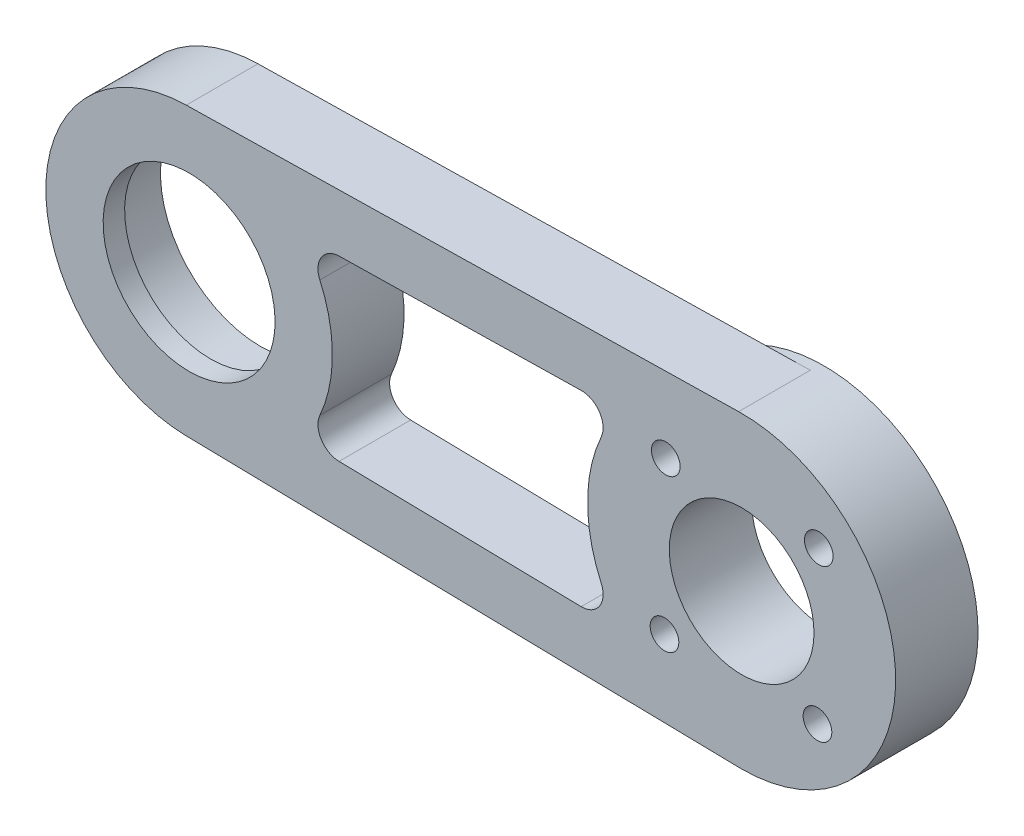
ISO-10303-21;
HEADER;
FILE_DESCRIPTION(('STEP AP214'),'2;1');
FILE_NAME('part.step','',(''),(''),'','','');
FILE_SCHEMA(('AUTOMOTIVE_DESIGN { 1 0 10303 214 1 1 1 1 }'));
ENDSEC;
DATA;
#1=APPLICATION_CONTEXT('core data for automotive mechanical design processes');
#2=APPLICATION_PROTOCOL_DEFINITION('international standard','automotive_design',2000,#1);
#3=PRODUCT_CONTEXT('',#1,'mechanical');
#4=PRODUCT('Part','Part','',(#3));
#5=PRODUCT_RELATED_PRODUCT_CATEGORY('part','',(#4));
#6=PRODUCT_DEFINITION_FORMATION('','',#4);
#7=PRODUCT_DEFINITION_CONTEXT('part definition',#1,'design');
#8=PRODUCT_DEFINITION('design','',#6,#7);
#9=PRODUCT_DEFINITION_SHAPE('','',#8);
#10=(LENGTH_UNIT() NAMED_UNIT(*) SI_UNIT(.MILLI.,.METRE.));
#11=(NAMED_UNIT(*) PLANE_ANGLE_UNIT() SI_UNIT($,.RADIAN.));
#12=(NAMED_UNIT(*) SI_UNIT($,.STERADIAN.) SOLID_ANGLE_UNIT());
#13=UNCERTAINTY_MEASURE_WITH_UNIT(LENGTH_MEASURE(1.E-05),#10,'distance_accuracy_value','');
#14=(GEOMETRIC_REPRESENTATION_CONTEXT(3) GLOBAL_UNCERTAINTY_ASSIGNED_CONTEXT((#13)) GLOBAL_UNIT_ASSIGNED_CONTEXT((#10,
#11,#12)) REPRESENTATION_CONTEXT('',''));
#15=CARTESIAN_POINT('',(0.,0.,0.));
#16=DIRECTION('',(0.,0.,1.));
#17=DIRECTION('',(1.,0.,0.));
#18=AXIS2_PLACEMENT_3D('',#15,#16,#17);
#19=CARTESIAN_POINT('',(39.3125,0.,89.2));
#20=DIRECTION('',(0.,0.,1.));
#21=DIRECTION('',(0.,1.,0.));
#22=AXIS2_PLACEMENT_3D('',#19,#20,#21);
#23=PLANE('',#22);
#24=CARTESIAN_POINT('',(87.8932333873582,10.5856105027242,89.2));
#25=DIRECTION('',(0.,0.,1.));
#26=DIRECTION('',(-1.,0.,0.));
#27=AXIS2_PLACEMENT_3D('',#24,#25,#26);
#28=CIRCLE('',#27,1.99999999999999);
#29=CARTESIAN_POINT('',(85.8932333873582,10.5856105027242,89.2));
#30=VERTEX_POINT('',#29);
#31=EDGE_CURVE('E618',#30,#30,#28,.T.);
#32=ORIENTED_EDGE('',*,*,#31,.F.);
#33=EDGE_LOOP('',(#32));
#34=FACE_BOUND('',#33,.T.);
#35=CARTESIAN_POINT('',(66.3567666126418,-10.5856105027242,89.2));
#36=DIRECTION('',(0.,0.,1.));
#37=DIRECTION('',(1.,0.,0.));
#38=AXIS2_PLACEMENT_3D('',#35,#36,#37);
#39=CIRCLE('',#38,2.);
#40=CARTESIAN_POINT('',(68.3567666126418,-10.5856105027242,89.2));
#41=VERTEX_POINT('',#40);
#42=EDGE_CURVE('E622',#41,#41,#39,.T.);
#43=ORIENTED_EDGE('',*,*,#42,.F.);
#44=EDGE_LOOP('',(#43));
#45=FACE_BOUND('',#44,.T.);
#46=CARTESIAN_POINT('',(87.7106105027242,-10.7682333873582,89.2));
#47=DIRECTION('',(0.,0.,1.));
#48=DIRECTION('',(-1.,0.,0.));
#49=AXIS2_PLACEMENT_3D('',#46,#47,#48);
#50=CIRCLE('',#49,1.99999999999999);
#51=CARTESIAN_POINT('',(85.7106105027242,-10.7682333873582,89.2));
#52=VERTEX_POINT('',#51);
#53=EDGE_CURVE('E631',#52,#52,#50,.T.);
#54=ORIENTED_EDGE('',*,*,#53,.F.);
#55=EDGE_LOOP('',(#54));
#56=FACE_BOUND('',#55,.T.);
#57=CARTESIAN_POINT('',(66.5393894972758,10.7682333873582,89.2));
#58=DIRECTION('',(0.,0.,1.));
#59=DIRECTION('',(1.,0.,0.));
#60=AXIS2_PLACEMENT_3D('',#57,#58,#59);
#61=CIRCLE('',#60,2.);
#62=CARTESIAN_POINT('',(68.5393894972758,10.7682333873582,89.2));
#63=VERTEX_POINT('',#62);
#64=EDGE_CURVE('E219',#63,#63,#61,.T.);
#65=ORIENTED_EDGE('',*,*,#64,.F.);
#66=EDGE_LOOP('',(#65));
#67=FACE_BOUND('',#66,.T.);
#68=CARTESIAN_POINT('',(54.7890294242375,10.0674931556305,89.2));
#69=DIRECTION('',(0.,0.,1.));
#70=DIRECTION('',(0.834598495743948,0.55085873951671,0.));
#71=AXIS2_PLACEMENT_3D('',#68,#69,#70);
#72=CIRCLE('',#71,3.);
#73=CARTESIAN_POINT('',(57.5240462294328,8.8347388916758,89.2));
#74=VERTEX_POINT('',#73);
#75=CARTESIAN_POINT('',(54.7306825846913,13.0669257096839,89.2));
#76=VERTEX_POINT('',#75);
#77=EDGE_CURVE('E240',#74,#76,#72,.T.);
#78=ORIENTED_EDGE('',*,*,#77,.F.);
#79=CARTESIAN_POINT('',(77.125,0.,89.2));
#80=DIRECTION('',(0.,0.,-1.));
#81=DIRECTION('',(0.,-1.,0.));
#82=AXIS2_PLACEMENT_3D('',#79,#80,#81);
#83=CIRCLE('',#82,21.5);
#84=CARTESIAN_POINT('',(57.5240462294328,-8.8347388916758,89.2));
#85=VERTEX_POINT('',#84);
#86=EDGE_CURVE('E299',#85,#74,#83,.T.);
#87=ORIENTED_EDGE('',*,*,#86,.F.);
#88=CARTESIAN_POINT('',(54.7890294242375,-10.0674931556305,89.2));
#89=DIRECTION('',(0.,0.,1.));
#90=DIRECTION('',(0.834598495743948,-0.55085873951671,0.));
#91=AXIS2_PLACEMENT_3D('',#88,#89,#90);
#92=CIRCLE('',#91,3.);
#93=CARTESIAN_POINT('',(54.7306825846913,-13.0669257096839,89.2));
#94=VERTEX_POINT('',#93);
#95=EDGE_CURVE('E250',#94,#85,#92,.T.);
#96=ORIENTED_EDGE('',*,*,#95,.F.);
#97=DIRECTION('',(0.999810851351115,-0.0194489465153972,0.));
#98=VECTOR('',#97,1.);
#99=CARTESIAN_POINT('',(49.5983229947105,-12.9670878383221,89.2));
#100=LINE('',#99,#98);
#101=CARTESIAN_POINT('',(20.9286196080458,-12.4093868221489,89.2));
#102=VERTEX_POINT('',#101);
#103=EDGE_CURVE('E195',#102,#94,#100,.T.);
#104=ORIENTED_EDGE('',*,*,#103,.F.);
#105=CARTESIAN_POINT('',(20.9869664475919,-9.40995426809553,89.2));
#106=DIRECTION('',(0.,0.,1.));
#107=DIRECTION('',(-0.844629437346953,-0.535351392607669,0.));
#108=AXIS2_PLACEMENT_3D('',#105,#106,#107);
#109=CIRCLE('',#108,3.);
#110=CARTESIAN_POINT('',(18.2495360413844,-8.18256892877871,89.2));
#111=VERTEX_POINT('',#110);
#112=EDGE_CURVE('E203',#111,#102,#109,.T.);
#113=ORIENTED_EDGE('',*,*,#112,.F.);
#114=CARTESIAN_POINT('',(0.,0.,89.2));
#115=DIRECTION('',(0.,0.,-1.));
#116=DIRECTION('',(-0.0194489465153973,-0.999810851351115,0.));
#117=AXIS2_PLACEMENT_3D('',#114,#115,#116);
#118=CIRCLE('',#117,20.);
#119=CARTESIAN_POINT('',(18.2495360413844,8.18256892877871,89.2));
#120=VERTEX_POINT('',#119);
#121=EDGE_CURVE('E236',#120,#111,#118,.T.);
#122=ORIENTED_EDGE('',*,*,#121,.F.);
#123=CARTESIAN_POINT('',(20.9869664475919,9.4099542680955,89.2));
#124=DIRECTION('',(0.,0.,1.));
#125=DIRECTION('',(-0.844629437346952,0.53535139260767,0.));
#126=AXIS2_PLACEMENT_3D('',#123,#124,#125);
#127=CIRCLE('',#126,3.);
#128=CARTESIAN_POINT('',(20.9286196080458,12.4093868221489,89.2));
#129=VERTEX_POINT('',#128);
#130=EDGE_CURVE('E227',#129,#120,#127,.T.);
#131=ORIENTED_EDGE('',*,*,#130,.F.);
#132=DIRECTION('',(-0.999810851351115,-0.0194489465153972,0.));
#133=VECTOR('',#132,1.);
#134=CARTESIAN_POINT('',(27.4139142496106,12.5355428330083,89.2));
#135=LINE('',#134,#133);
#136=EDGE_CURVE('E223',#76,#129,#135,.T.);
#137=ORIENTED_EDGE('',*,*,#136,.F.);
#138=EDGE_LOOP('',(#78,#87,#96,#104,#113,#122,#131,#137));
#139=FACE_BOUND('',#138,.T.);
#140=CARTESIAN_POINT('',(77.125,0.,89.2));
#141=DIRECTION('',(0.,0.,-1.));
#142=DIRECTION('',(0.,-1.,0.));
#143=AXIS2_PLACEMENT_3D('',#140,#141,#142);
#144=CIRCLE('',#143,21.5);
#145=CARTESIAN_POINT('',(76.706847649919,21.4959333040489,89.2));
#146=VERTEX_POINT('',#145);
#147=CARTESIAN_POINT('',(76.706847649919,-21.495933304049,89.2));
#148=VERTEX_POINT('',#147);
#149=EDGE_CURVE('E283',#146,#148,#144,.T.);
#150=ORIENTED_EDGE('',*,*,#149,.F.);
#151=DIRECTION('',(0.999810851351115,0.0194489465153971,0.));
#152=VECTOR('',#151,1.);
#153=CARTESIAN_POINT('',(57.807749156792,21.1282962102074,89.2));
#154=LINE('',#153,#152);
#155=CARTESIAN_POINT('',(-0.388978930307898,19.9962170270223,89.2));
#156=VERTEX_POINT('',#155);
#157=EDGE_CURVE('E346',#156,#146,#154,.T.);
#158=ORIENTED_EDGE('',*,*,#157,.F.);
#159=CARTESIAN_POINT('',(0.,0.,89.2));
#160=DIRECTION('',(0.,0.,-1.));
#161=DIRECTION('',(-0.0194489465153973,0.999810851351115,0.));
#162=AXIS2_PLACEMENT_3D('',#159,#160,#161);
#163=CIRCLE('',#162,20.);
#164=CARTESIAN_POINT('',(-0.388978930307898,-19.9962170270223,89.2));
#165=VERTEX_POINT('',#164);
#166=EDGE_CURVE('E70',#165,#156,#163,.T.);
#167=ORIENTED_EDGE('',*,*,#166,.F.);
#168=DIRECTION('',(-0.999810851351115,0.0194489465153972,0.));
#169=VECTOR('',#168,1.);
#170=CARTESIAN_POINT('',(19.2598358666786,-20.378438071694,89.2));
#171=LINE('',#170,#169);
#172=EDGE_CURVE('E350',#148,#165,#171,.T.);
#173=ORIENTED_EDGE('',*,*,#172,.F.);
#174=EDGE_LOOP('',(#150,#158,#167,#173));
#175=FACE_BOUND('',#174,.T.);
#176=CARTESIAN_POINT('',(0.,0.,89.2));
#177=DIRECTION('',(0.,0.,1.));
#178=DIRECTION('',(0.,1.,0.));
#179=AXIS2_PLACEMENT_3D('',#176,#177,#178);
#180=CIRCLE('',#179,12.);
#181=CARTESIAN_POINT('',(0.,-12.,89.2));
#182=VERTEX_POINT('',#181);
#183=EDGE_CURVE('E323',#182,#182,#180,.T.);
#184=ORIENTED_EDGE('',*,*,#183,.F.);
#185=EDGE_LOOP('',(#184));
#186=FACE_BOUND('',#185,.T.);
#187=CARTESIAN_POINT('',(77.125,0.,89.2));
#188=DIRECTION('',(0.,0.,1.));
#189=DIRECTION('',(0.,1.,0.));
#190=AXIS2_PLACEMENT_3D('',#187,#188,#189);
#191=CIRCLE('',#190,10.1);
#192=CARTESIAN_POINT('',(77.125,10.1,89.2));
#193=VERTEX_POINT('',#192);
#194=EDGE_CURVE('E11',#193,#193,#191,.T.);
#195=ORIENTED_EDGE('',*,*,#194,.F.);
#196=EDGE_LOOP('',(#195));
#197=FACE_BOUND('',#196,.T.);
#198=ADVANCED_FACE('F51',(#34,#45,#56,#67,#139,#175,#186,#197),#23,.T.);
#199=CARTESIAN_POINT('',(77.125,0.,77.7));
#200=DIRECTION('',(0.,0.,1.));
#201=DIRECTION('',(0.,1.,0.));
#202=AXIS2_PLACEMENT_3D('',#199,#200,#201);
#203=PLANE('',#202);
#204=CARTESIAN_POINT('',(87.8932333873582,10.5856105027242,77.7));
#205=DIRECTION('',(0.,0.,1.));
#206=DIRECTION('',(-1.,0.,0.));
#207=AXIS2_PLACEMENT_3D('',#204,#205,#206);
#208=CIRCLE('',#207,1.99999999999999);
#209=CARTESIAN_POINT('',(85.8932333873582,10.5856105027242,77.7));
#210=VERTEX_POINT('',#209);
#211=EDGE_CURVE('E615',#210,#210,#208,.T.);
#212=ORIENTED_EDGE('',*,*,#211,.T.);
#213=EDGE_LOOP('',(#212));
#214=FACE_BOUND('',#213,.T.);
#215=CARTESIAN_POINT('',(66.3567666126418,-10.5856105027242,77.7));
#216=DIRECTION('',(0.,0.,1.));
#217=DIRECTION('',(1.,0.,0.));
#218=AXIS2_PLACEMENT_3D('',#215,#216,#217);
#219=CIRCLE('',#218,2.);
#220=CARTESIAN_POINT('',(68.3567666126418,-10.5856105027242,77.7));
#221=VERTEX_POINT('',#220);
#222=EDGE_CURVE('E619',#221,#221,#219,.T.);
#223=ORIENTED_EDGE('',*,*,#222,.T.);
#224=EDGE_LOOP('',(#223));
#225=FACE_BOUND('',#224,.T.);
#226=CARTESIAN_POINT('',(87.7106105027242,-10.7682333873582,77.7));
#227=DIRECTION('',(0.,0.,1.));
#228=DIRECTION('',(-1.,0.,0.));
#229=AXIS2_PLACEMENT_3D('',#226,#227,#228);
#230=CIRCLE('',#229,1.99999999999999);
#231=CARTESIAN_POINT('',(85.7106105027242,-10.7682333873582,77.7));
#232=VERTEX_POINT('',#231);
#233=EDGE_CURVE('E628',#232,#232,#230,.T.);
#234=ORIENTED_EDGE('',*,*,#233,.T.);
#235=EDGE_LOOP('',(#234));
#236=FACE_BOUND('',#235,.T.);
#237=CARTESIAN_POINT('',(66.5393894972758,10.7682333873582,77.7));
#238=DIRECTION('',(0.,0.,1.));
#239=DIRECTION('',(1.,0.,0.));
#240=AXIS2_PLACEMENT_3D('',#237,#238,#239);
#241=CIRCLE('',#240,2.);
#242=CARTESIAN_POINT('',(68.5393894972758,10.7682333873582,77.7));
#243=VERTEX_POINT('',#242);
#244=EDGE_CURVE('E213',#243,#243,#241,.T.);
#245=ORIENTED_EDGE('',*,*,#244,.T.);
#246=EDGE_LOOP('',(#245));
#247=FACE_BOUND('',#246,.T.);
#248=CARTESIAN_POINT('',(77.125,0.,77.7));
#249=DIRECTION('',(0.,0.,1.));
#250=DIRECTION('',(0.,1.,0.));
#251=AXIS2_PLACEMENT_3D('',#248,#249,#250);
#252=CIRCLE('',#251,10.1);
#253=CARTESIAN_POINT('',(77.125,10.1,77.7));
#254=VERTEX_POINT('',#253);
#255=EDGE_CURVE('E59',#254,#254,#252,.T.);
#256=ORIENTED_EDGE('',*,*,#255,.T.);
#257=EDGE_LOOP('',(#256));
#258=FACE_BOUND('',#257,.T.);
#259=CARTESIAN_POINT('',(77.125,0.,77.7));
#260=DIRECTION('',(0.,0.,-1.));
#261=DIRECTION('',(0.,-1.,0.));
#262=AXIS2_PLACEMENT_3D('',#259,#260,#261);
#263=CIRCLE('',#262,21.5);
#264=CARTESIAN_POINT('',(77.125,-21.5,77.7));
#265=VERTEX_POINT('',#264);
#266=EDGE_CURVE('E274',#265,#265,#263,.T.);
#267=ORIENTED_EDGE('',*,*,#266,.T.);
#268=EDGE_LOOP('',(#267));
#269=FACE_BOUND('',#268,.T.);
#270=ADVANCED_FACE('F497',(#214,#225,#236,#247,#258,#269),#203,.F.);
#271=CARTESIAN_POINT('',(77.125,0.,79.2));
#272=DIRECTION('',(0.,0.,-1.));
#273=DIRECTION('',(0.,1.,0.));
#274=AXIS2_PLACEMENT_3D('',#271,#272,#273);
#275=CYLINDRICAL_SURFACE('',#274,10.1);
#276=ORIENTED_EDGE('',*,*,#194,.T.);
#277=EDGE_LOOP('',(#276));
#278=FACE_BOUND('',#277,.T.);
#279=ORIENTED_EDGE('',*,*,#255,.F.);
#280=EDGE_LOOP('',(#279));
#281=FACE_BOUND('',#280,.T.);
#282=ADVANCED_FACE('F489',(#278,#281),#275,.F.);
#283=CARTESIAN_POINT('',(0.,0.,79.2));
#284=DIRECTION('',(0.,0.,1.));
#285=DIRECTION('',(-0.0194489465153973,0.999810851351115,0.));
#286=AXIS2_PLACEMENT_3D('',#283,#284,#285);
#287=CYLINDRICAL_SURFACE('',#286,20.);
#288=CARTESIAN_POINT('',(0.,0.,79.2));
#289=DIRECTION('',(0.,0.,1.));
#290=DIRECTION('',(-0.0194489465153973,0.999810851351115,0.));
#291=AXIS2_PLACEMENT_3D('',#288,#289,#290);
#292=CIRCLE('',#291,20.);
#293=CARTESIAN_POINT('',(-0.388978930307898,19.9962170270223,79.2));
#294=VERTEX_POINT('',#293);
#295=CARTESIAN_POINT('',(-0.388978930307898,-19.9962170270223,79.2));
#296=VERTEX_POINT('',#295);
#297=EDGE_CURVE('E307',#294,#296,#292,.T.);
#298=ORIENTED_EDGE('',*,*,#297,.T.);
#299=DIRECTION('',(0.,0.,1.));
#300=VECTOR('',#299,1.);
#301=CARTESIAN_POINT('',(-0.388978930307898,-19.9962170270223,79.2));
#302=LINE('',#301,#300);
#303=EDGE_CURVE('E354',#296,#165,#302,.T.);
#304=ORIENTED_EDGE('',*,*,#303,.T.);
#305=ORIENTED_EDGE('',*,*,#166,.T.);
#306=DIRECTION('',(0.,0.,1.));
#307=VECTOR('',#306,1.);
#308=CARTESIAN_POINT('',(-0.388978930307898,19.9962170270223,79.2));
#309=LINE('',#308,#307);
#310=EDGE_CURVE('E278',#294,#156,#309,.T.);
#311=ORIENTED_EDGE('',*,*,#310,.F.);
#312=EDGE_LOOP('',(#298,#304,#305,#311));
#313=FACE_BOUND('',#312,.T.);
#314=ADVANCED_FACE('F480',(#313),#287,.T.);
#315=CARTESIAN_POINT('',(-0.388978930307898,-19.9962170270223,79.2));
#316=DIRECTION('',(-0.0194489465153972,-0.999810851351115,0.));
#317=DIRECTION('',(0.999810851351115,-0.0194489465153972,0.));
#318=AXIS2_PLACEMENT_3D('',#315,#316,#317);
#319=PLANE('',#318);
#320=DIRECTION('',(0.999810851351115,-0.0194489465153972,0.));
#321=VECTOR('',#320,1.);
#322=CARTESIAN_POINT('',(-0.388978930307898,-19.9962170270223,79.2));
#323=LINE('',#322,#321);
#324=CARTESIAN_POINT('',(76.706847649919,-21.495933304049,79.2));
#325=VERTEX_POINT('',#324);
#326=EDGE_CURVE('E304',#296,#325,#323,.T.);
#327=ORIENTED_EDGE('',*,*,#326,.T.);
#328=DIRECTION('',(0.,0.,1.));
#329=VECTOR('',#328,1.);
#330=CARTESIAN_POINT('',(76.706847649919,-21.495933304049,79.2));
#331=LINE('',#330,#329);
#332=EDGE_CURVE('E287',#325,#148,#331,.T.);
#333=ORIENTED_EDGE('',*,*,#332,.T.);
#334=ORIENTED_EDGE('',*,*,#172,.T.);
#335=ORIENTED_EDGE('',*,*,#303,.F.);
#336=EDGE_LOOP('',(#327,#333,#334,#335));
#337=FACE_BOUND('',#336,.T.);
#338=ADVANCED_FACE('F432',(#337),#319,.T.);
#339=CARTESIAN_POINT('',(76.706847649919,21.4959333040489,79.2));
#340=DIRECTION('',(-0.0194489465153971,0.999810851351115,0.));
#341=DIRECTION('',(0.,0.,-1.));
#342=AXIS2_PLACEMENT_3D('',#339,#340,#341);
#343=PLANE('',#342);
#344=DIRECTION('',(-0.999810851351115,-0.0194489465153971,0.));
#345=VECTOR('',#344,1.);
#346=CARTESIAN_POINT('',(76.706847649919,21.4959333040489,79.2));
#347=LINE('',#346,#345);
#348=CARTESIAN_POINT('',(76.706847649919,21.4959333040489,79.2));
#349=VERTEX_POINT('',#348);
#350=EDGE_CURVE('E315',#349,#294,#347,.T.);
#351=ORIENTED_EDGE('',*,*,#350,.T.);
#352=ORIENTED_EDGE('',*,*,#310,.T.);
#353=ORIENTED_EDGE('',*,*,#157,.T.);
#354=DIRECTION('',(0.,0.,1.));
#355=VECTOR('',#354,1.);
#356=CARTESIAN_POINT('',(76.706847649919,21.4959333040489,79.2));
#357=LINE('',#356,#355);
#358=EDGE_CURVE('E292',#349,#146,#357,.T.);
#359=ORIENTED_EDGE('',*,*,#358,.F.);
#360=EDGE_LOOP('',(#351,#352,#353,#359));
#361=FACE_BOUND('',#360,.T.);
#362=ADVANCED_FACE('F366',(#361),#343,.T.);
#363=CARTESIAN_POINT('',(0.,0.,79.2));
#364=DIRECTION('',(0.,0.,1.));
#365=DIRECTION('',(0.,1.,0.));
#366=AXIS2_PLACEMENT_3D('',#363,#364,#365);
#367=CYLINDRICAL_SURFACE('',#366,14.);
#368=CARTESIAN_POINT('',(0.,0.,86.2));
#369=DIRECTION('',(0.,0.,-1.));
#370=DIRECTION('',(0.,1.,0.));
#371=AXIS2_PLACEMENT_3D('',#368,#369,#370);
#372=CIRCLE('',#371,14.);
#373=CARTESIAN_POINT('',(0.,-14.,86.2));
#374=VERTEX_POINT('',#373);
#375=EDGE_CURVE('E308',#374,#374,#372,.T.);
#376=ORIENTED_EDGE('',*,*,#375,.F.);
#377=DIRECTION('',(0.,0.,-1.));
#378=VECTOR('',#377,1.);
#379=CARTESIAN_POINT('',(0.,-14.,79.2));
#380=LINE('',#379,#378);
#381=CARTESIAN_POINT('',(0.,-14.,79.2));
#382=VERTEX_POINT('',#381);
#383=EDGE_CURVE('E275',#374,#382,#380,.T.);
#384=ORIENTED_EDGE('',*,*,#383,.T.);
#385=CARTESIAN_POINT('',(0.,0.,79.2));
#386=DIRECTION('',(0.,0.,-1.));
#387=DIRECTION('',(0.,1.,0.));
#388=AXIS2_PLACEMENT_3D('',#385,#386,#387);
#389=CIRCLE('',#388,14.);
#390=EDGE_CURVE('E279',#382,#382,#389,.T.);
#391=ORIENTED_EDGE('',*,*,#390,.T.);
#392=ORIENTED_EDGE('',*,*,#383,.F.);
#393=EDGE_LOOP('',(#376,#384,#391,#392));
#394=FACE_BOUND('',#393,.T.);
#395=ADVANCED_FACE('F361',(#394),#367,.F.);
#396=CARTESIAN_POINT('',(39.3125,0.,79.2));
#397=DIRECTION('',(0.,0.,1.));
#398=DIRECTION('',(0.,1.,0.));
#399=AXIS2_PLACEMENT_3D('',#396,#397,#398);
#400=PLANE('',#399);
#401=ORIENTED_EDGE('',*,*,#390,.F.);
#402=EDGE_LOOP('',(#401));
#403=FACE_BOUND('',#402,.T.);
#404=CARTESIAN_POINT('',(77.125,0.,79.2));
#405=DIRECTION('',(0.,0.,1.));
#406=DIRECTION('',(0.,-1.,0.));
#407=AXIS2_PLACEMENT_3D('',#404,#405,#406);
#408=CIRCLE('',#407,21.5);
#409=CARTESIAN_POINT('',(57.5240462294328,-8.8347388916758,79.2));
#410=VERTEX_POINT('',#409);
#411=EDGE_CURVE('E291',#410,#325,#408,.T.);
#412=ORIENTED_EDGE('',*,*,#411,.T.);
#413=ORIENTED_EDGE('',*,*,#326,.F.);
#414=ORIENTED_EDGE('',*,*,#297,.F.);
#415=ORIENTED_EDGE('',*,*,#350,.F.);
#416=CARTESIAN_POINT('',(77.125,0.,79.2));
#417=DIRECTION('',(0.,0.,1.));
#418=DIRECTION('',(0.,-1.,0.));
#419=AXIS2_PLACEMENT_3D('',#416,#417,#418);
#420=CIRCLE('',#419,21.5);
#421=CARTESIAN_POINT('',(57.5240462294328,8.8347388916758,79.2));
#422=VERTEX_POINT('',#421);
#423=EDGE_CURVE('E296',#349,#422,#420,.T.);
#424=ORIENTED_EDGE('',*,*,#423,.T.);
#425=CARTESIAN_POINT('',(54.7890294242375,10.0674931556305,79.2));
#426=DIRECTION('',(0.,0.,-1.));
#427=DIRECTION('',(0.834598495743948,0.55085873951671,0.));
#428=AXIS2_PLACEMENT_3D('',#425,#426,#427);
#429=CIRCLE('',#428,3.);
#430=CARTESIAN_POINT('',(54.7306825846913,13.0669257096839,79.2));
#431=VERTEX_POINT('',#430);
#432=EDGE_CURVE('E194',#431,#422,#429,.T.);
#433=ORIENTED_EDGE('',*,*,#432,.F.);
#434=DIRECTION('',(0.999810851351115,0.0194489465153972,0.));
#435=VECTOR('',#434,1.);
#436=CARTESIAN_POINT('',(15.7635862634331,12.3089133604597,79.2));
#437=LINE('',#436,#435);
#438=CARTESIAN_POINT('',(20.9286196080458,12.4093868221489,79.2));
#439=VERTEX_POINT('',#438);
#440=EDGE_CURVE('E226',#439,#431,#437,.T.);
#441=ORIENTED_EDGE('',*,*,#440,.F.);
#442=CARTESIAN_POINT('',(20.9869664475919,9.4099542680955,79.2));
#443=DIRECTION('',(0.,0.,-1.));
#444=DIRECTION('',(-0.844629437346952,0.53535139260767,0.));
#445=AXIS2_PLACEMENT_3D('',#442,#443,#444);
#446=CIRCLE('',#445,3.);
#447=CARTESIAN_POINT('',(18.2495360413844,8.18256892877871,79.2));
#448=VERTEX_POINT('',#447);
#449=EDGE_CURVE('E257',#448,#439,#446,.T.);
#450=ORIENTED_EDGE('',*,*,#449,.F.);
#451=CARTESIAN_POINT('',(0.,0.,79.2));
#452=DIRECTION('',(0.,0.,1.));
#453=DIRECTION('',(-0.0194489465153973,-0.999810851351115,0.));
#454=AXIS2_PLACEMENT_3D('',#451,#452,#453);
#455=CIRCLE('',#454,20.);
#456=CARTESIAN_POINT('',(18.2495360413844,-8.18256892877871,79.2));
#457=VERTEX_POINT('',#456);
#458=EDGE_CURVE('E205',#457,#448,#455,.T.);
#459=ORIENTED_EDGE('',*,*,#458,.F.);
#460=CARTESIAN_POINT('',(20.9869664475919,-9.40995426809553,79.2));
#461=DIRECTION('',(0.,0.,-1.));
#462=DIRECTION('',(-0.844629437346953,-0.535351392607669,0.));
#463=AXIS2_PLACEMENT_3D('',#460,#461,#462);
#464=CIRCLE('',#463,3.);
#465=CARTESIAN_POINT('',(20.9286196080458,-12.4093868221489,79.2));
#466=VERTEX_POINT('',#465);
#467=EDGE_CURVE('E201',#466,#457,#464,.T.);
#468=ORIENTED_EDGE('',*,*,#467,.F.);
#469=DIRECTION('',(-0.999810851351115,0.0194489465153972,0.));
#470=VECTOR('',#469,1.);
#471=CARTESIAN_POINT('',(60.1324037536325,-13.1720033710874,79.2));
#472=LINE('',#471,#470);
#473=CARTESIAN_POINT('',(54.7306825846913,-13.0669257096839,79.2));
#474=VERTEX_POINT('',#473);
#475=EDGE_CURVE('E182',#474,#466,#472,.T.);
#476=ORIENTED_EDGE('',*,*,#475,.F.);
#477=CARTESIAN_POINT('',(54.7890294242375,-10.0674931556305,79.2));
#478=DIRECTION('',(0.,0.,-1.));
#479=DIRECTION('',(0.834598495743948,-0.55085873951671,0.));
#480=AXIS2_PLACEMENT_3D('',#477,#478,#479);
#481=CIRCLE('',#480,3.);
#482=EDGE_CURVE('E239',#410,#474,#481,.T.);
#483=ORIENTED_EDGE('',*,*,#482,.F.);
#484=EDGE_LOOP('',(#412,#413,#414,#415,#424,#433,#441,#450,#459,#468,#476,#483));
#485=FACE_BOUND('',#484,.T.);
#486=ADVANCED_FACE('F208',(#403,#485),#400,.F.);
#487=CARTESIAN_POINT('',(39.3125,0.,86.2));
#488=DIRECTION('',(0.,0.,1.));
#489=DIRECTION('',(0.,1.,0.));
#490=AXIS2_PLACEMENT_3D('',#487,#488,#489);
#491=PLANE('',#490);
#492=CARTESIAN_POINT('',(0.,0.,86.2));
#493=DIRECTION('',(0.,0.,1.));
#494=DIRECTION('',(0.,1.,0.));
#495=AXIS2_PLACEMENT_3D('',#492,#493,#494);
#496=CIRCLE('',#495,12.);
#497=CARTESIAN_POINT('',(0.,-12.,86.2));
#498=VERTEX_POINT('',#497);
#499=EDGE_CURVE('E331',#498,#498,#496,.T.);
#500=ORIENTED_EDGE('',*,*,#499,.T.);
#501=EDGE_LOOP('',(#500));
#502=FACE_BOUND('',#501,.T.);
#503=ORIENTED_EDGE('',*,*,#375,.T.);
#504=EDGE_LOOP('',(#503));
#505=FACE_BOUND('',#504,.T.);
#506=ADVANCED_FACE('F417',(#502,#505),#491,.F.);
#507=CARTESIAN_POINT('',(0.,0.,79.2));
#508=DIRECTION('',(0.,0.,1.));
#509=DIRECTION('',(0.,1.,0.));
#510=AXIS2_PLACEMENT_3D('',#507,#508,#509);
#511=CYLINDRICAL_SURFACE('',#510,12.);
#512=ORIENTED_EDGE('',*,*,#183,.T.);
#513=DIRECTION('',(0.,0.,-1.));
#514=VECTOR('',#513,1.);
#515=CARTESIAN_POINT('',(0.,-12.,79.2));
#516=LINE('',#515,#514);
#517=EDGE_CURVE('E327',#182,#498,#516,.T.);
#518=ORIENTED_EDGE('',*,*,#517,.T.);
#519=ORIENTED_EDGE('',*,*,#499,.F.);
#520=ORIENTED_EDGE('',*,*,#517,.F.);
#521=EDGE_LOOP('',(#512,#518,#519,#520));
#522=FACE_BOUND('',#521,.T.);
#523=ADVANCED_FACE('F457',(#522),#511,.F.);
#524=CARTESIAN_POINT('',(15.7635862634331,12.3089133604597,79.2));
#525=DIRECTION('',(0.0194489465153972,-0.999810851351115,0.));
#526=DIRECTION('',(0.,0.,1.));
#527=AXIS2_PLACEMENT_3D('',#524,#525,#526);
#528=PLANE('',#527);
#529=DIRECTION('',(0.,0.,-1.));
#530=VECTOR('',#529,1.);
#531=CARTESIAN_POINT('',(54.7306825846913,13.0669257096839,79.2));
#532=LINE('',#531,#530);
#533=EDGE_CURVE('E244',#76,#431,#532,.T.);
#534=ORIENTED_EDGE('',*,*,#533,.F.);
#535=ORIENTED_EDGE('',*,*,#136,.T.);
#536=DIRECTION('',(0.,0.,1.));
#537=VECTOR('',#536,1.);
#538=CARTESIAN_POINT('',(20.9286196080458,12.4093868221489,79.2));
#539=LINE('',#538,#537);
#540=EDGE_CURVE('E253',#439,#129,#539,.T.);
#541=ORIENTED_EDGE('',*,*,#540,.F.);
#542=ORIENTED_EDGE('',*,*,#440,.T.);
#543=EDGE_LOOP('',(#534,#535,#541,#542));
#544=FACE_BOUND('',#543,.T.);
#545=ADVANCED_FACE('F448',(#544),#528,.T.);
#546=CARTESIAN_POINT('',(20.9869664475919,9.4099542680955,79.2));
#547=DIRECTION('',(0.,0.,1.));
#548=DIRECTION('',(-0.844629437346952,0.53535139260767,0.));
#549=AXIS2_PLACEMENT_3D('',#546,#547,#548);
#550=CYLINDRICAL_SURFACE('',#549,3.);
#551=ORIENTED_EDGE('',*,*,#449,.T.);
#552=ORIENTED_EDGE('',*,*,#540,.T.);
#553=ORIENTED_EDGE('',*,*,#130,.T.);
#554=DIRECTION('',(0.,0.,-1.));
#555=VECTOR('',#554,1.);
#556=CARTESIAN_POINT('',(18.2495360413844,8.18256892877871,79.2));
#557=LINE('',#556,#555);
#558=EDGE_CURVE('E232',#120,#448,#557,.T.);
#559=ORIENTED_EDGE('',*,*,#558,.T.);
#560=EDGE_LOOP('',(#551,#552,#553,#559));
#561=FACE_BOUND('',#560,.T.);
#562=ADVANCED_FACE('F399',(#561),#550,.F.);
#563=CARTESIAN_POINT('',(77.125,0.,79.2));
#564=DIRECTION('',(0.,0.,-1.));
#565=DIRECTION('',(0.,-1.,0.));
#566=AXIS2_PLACEMENT_3D('',#563,#564,#565);
#567=CYLINDRICAL_SURFACE('',#566,21.5);
#568=ORIENTED_EDGE('',*,*,#358,.T.);
#569=ORIENTED_EDGE('',*,*,#149,.T.);
#570=ORIENTED_EDGE('',*,*,#332,.F.);
#571=ORIENTED_EDGE('',*,*,#411,.F.);
#572=DIRECTION('',(0.,0.,-1.));
#573=VECTOR('',#572,1.);
#574=CARTESIAN_POINT('',(57.5240462294328,-8.8347388916758,79.2));
#575=LINE('',#574,#573);
#576=EDGE_CURVE('E246',#85,#410,#575,.T.);
#577=ORIENTED_EDGE('',*,*,#576,.F.);
#578=ORIENTED_EDGE('',*,*,#86,.T.);
#579=DIRECTION('',(0.,0.,1.));
#580=VECTOR('',#579,1.);
#581=CARTESIAN_POINT('',(57.5240462294328,8.8347388916758,79.2));
#582=LINE('',#581,#580);
#583=EDGE_CURVE('E245',#422,#74,#582,.T.);
#584=ORIENTED_EDGE('',*,*,#583,.F.);
#585=ORIENTED_EDGE('',*,*,#423,.F.);
#586=EDGE_LOOP('',(#568,#569,#570,#571,#577,#578,#584,#585));
#587=FACE_BOUND('',#586,.T.);
#588=ORIENTED_EDGE('',*,*,#266,.F.);
#589=EDGE_LOOP('',(#588));
#590=FACE_BOUND('',#589,.T.);
#591=ADVANCED_FACE('F393',(#587,#590),#567,.T.);
#592=CARTESIAN_POINT('',(54.7890294242375,10.0674931556305,79.2));
#593=DIRECTION('',(0.,0.,1.));
#594=DIRECTION('',(0.834598495743948,0.55085873951671,0.));
#595=AXIS2_PLACEMENT_3D('',#592,#593,#594);
#596=CYLINDRICAL_SURFACE('',#595,3.);
#597=ORIENTED_EDGE('',*,*,#432,.T.);
#598=ORIENTED_EDGE('',*,*,#583,.T.);
#599=ORIENTED_EDGE('',*,*,#77,.T.);
#600=ORIENTED_EDGE('',*,*,#533,.T.);
#601=EDGE_LOOP('',(#597,#598,#599,#600));
#602=FACE_BOUND('',#601,.T.);
#603=ADVANCED_FACE('F398',(#602),#596,.F.);
#604=CARTESIAN_POINT('',(60.1324037536325,-13.1720033710874,79.2));
#605=DIRECTION('',(0.0194489465153972,0.999810851351115,0.));
#606=DIRECTION('',(0.,0.,-1.));
#607=AXIS2_PLACEMENT_3D('',#604,#605,#606);
#608=PLANE('',#607);
#609=DIRECTION('',(0.,0.,-1.));
#610=VECTOR('',#609,1.);
#611=CARTESIAN_POINT('',(20.9286196080458,-12.4093868221489,79.2));
#612=LINE('',#611,#610);
#613=EDGE_CURVE('E185',#102,#466,#612,.T.);
#614=ORIENTED_EDGE('',*,*,#613,.F.);
#615=ORIENTED_EDGE('',*,*,#103,.T.);
#616=DIRECTION('',(0.,0.,1.));
#617=VECTOR('',#616,1.);
#618=CARTESIAN_POINT('',(54.7306825846913,-13.0669257096839,79.2));
#619=LINE('',#618,#617);
#620=EDGE_CURVE('E188',#474,#94,#619,.T.);
#621=ORIENTED_EDGE('',*,*,#620,.F.);
#622=ORIENTED_EDGE('',*,*,#475,.T.);
#623=EDGE_LOOP('',(#614,#615,#621,#622));
#624=FACE_BOUND('',#623,.T.);
#625=ADVANCED_FACE('F184',(#624),#608,.T.);
#626=CARTESIAN_POINT('',(54.7890294242375,-10.0674931556305,79.2));
#627=DIRECTION('',(0.,0.,1.));
#628=DIRECTION('',(0.834598495743948,-0.55085873951671,0.));
#629=AXIS2_PLACEMENT_3D('',#626,#627,#628);
#630=CYLINDRICAL_SURFACE('',#629,3.);
#631=ORIENTED_EDGE('',*,*,#482,.T.);
#632=ORIENTED_EDGE('',*,*,#620,.T.);
#633=ORIENTED_EDGE('',*,*,#95,.T.);
#634=ORIENTED_EDGE('',*,*,#576,.T.);
#635=EDGE_LOOP('',(#631,#632,#633,#634));
#636=FACE_BOUND('',#635,.T.);
#637=ADVANCED_FACE('F378',(#636),#630,.F.);
#638=CARTESIAN_POINT('',(0.,0.,79.2));
#639=DIRECTION('',(0.,0.,1.));
#640=DIRECTION('',(-0.0194489465153973,-0.999810851351115,0.));
#641=AXIS2_PLACEMENT_3D('',#638,#639,#640);
#642=CYLINDRICAL_SURFACE('',#641,20.);
#643=DIRECTION('',(0.,0.,1.));
#644=VECTOR('',#643,1.);
#645=CARTESIAN_POINT('',(18.2495360413844,-8.18256892877871,79.2));
#646=LINE('',#645,#644);
#647=EDGE_CURVE('E212',#457,#111,#646,.T.);
#648=ORIENTED_EDGE('',*,*,#647,.F.);
#649=ORIENTED_EDGE('',*,*,#458,.T.);
#650=ORIENTED_EDGE('',*,*,#558,.F.);
#651=ORIENTED_EDGE('',*,*,#121,.T.);
#652=EDGE_LOOP('',(#648,#649,#650,#651));
#653=FACE_BOUND('',#652,.T.);
#654=ADVANCED_FACE('F373',(#653),#642,.T.);
#655=CARTESIAN_POINT('',(20.9869664475919,-9.40995426809553,79.2));
#656=DIRECTION('',(0.,0.,1.));
#657=DIRECTION('',(-0.844629437346953,-0.535351392607669,0.));
#658=AXIS2_PLACEMENT_3D('',#655,#656,#657);
#659=CYLINDRICAL_SURFACE('',#658,3.);
#660=ORIENTED_EDGE('',*,*,#467,.T.);
#661=ORIENTED_EDGE('',*,*,#647,.T.);
#662=ORIENTED_EDGE('',*,*,#112,.T.);
#663=ORIENTED_EDGE('',*,*,#613,.T.);
#664=EDGE_LOOP('',(#660,#661,#662,#663));
#665=FACE_BOUND('',#664,.T.);
#666=ADVANCED_FACE('F199',(#665),#659,.F.);
#667=CARTESIAN_POINT('',(66.5393894972758,10.7682333873582,77.7));
#668=DIRECTION('',(0.,0.,1.));
#669=DIRECTION('',(1.,0.,0.));
#670=AXIS2_PLACEMENT_3D('',#667,#668,#669);
#671=CYLINDRICAL_SURFACE('',#670,2.);
#672=ORIENTED_EDGE('',*,*,#244,.F.);
#673=EDGE_LOOP('',(#672));
#674=FACE_BOUND('',#673,.T.);
#675=ORIENTED_EDGE('',*,*,#64,.T.);
#676=EDGE_LOOP('',(#675));
#677=FACE_BOUND('',#676,.T.);
#678=ADVANCED_FACE('F388',(#674,#677),#671,.F.);
#679=CARTESIAN_POINT('',(87.7106105027242,-10.7682333873582,77.7));
#680=DIRECTION('',(0.,0.,1.));
#681=DIRECTION('',(1.,0.,0.));
#682=AXIS2_PLACEMENT_3D('',#679,#680,#681);
#683=CYLINDRICAL_SURFACE('',#682,1.99999999999999);
#684=ORIENTED_EDGE('',*,*,#233,.F.);
#685=EDGE_LOOP('',(#684));
#686=FACE_BOUND('',#685,.T.);
#687=ORIENTED_EDGE('',*,*,#53,.T.);
#688=EDGE_LOOP('',(#687));
#689=FACE_BOUND('',#688,.T.);
#690=ADVANCED_FACE('F578',(#686,#689),#683,.F.);
#691=CARTESIAN_POINT('',(66.3567666126418,-10.5856105027242,77.7));
#692=DIRECTION('',(0.,0.,1.));
#693=DIRECTION('',(1.,0.,0.));
#694=AXIS2_PLACEMENT_3D('',#691,#692,#693);
#695=CYLINDRICAL_SURFACE('',#694,2.);
#696=ORIENTED_EDGE('',*,*,#222,.F.);
#697=EDGE_LOOP('',(#696));
#698=FACE_BOUND('',#697,.T.);
#699=ORIENTED_EDGE('',*,*,#42,.T.);
#700=EDGE_LOOP('',(#699));
#701=FACE_BOUND('',#700,.T.);
#702=ADVANCED_FACE('F586',(#698,#701),#695,.F.);
#703=CARTESIAN_POINT('',(87.8932333873582,10.5856105027242,77.7));
#704=DIRECTION('',(0.,0.,1.));
#705=DIRECTION('',(1.,0.,0.));
#706=AXIS2_PLACEMENT_3D('',#703,#704,#705);
#707=CYLINDRICAL_SURFACE('',#706,1.99999999999999);
#708=ORIENTED_EDGE('',*,*,#211,.F.);
#709=EDGE_LOOP('',(#708));
#710=FACE_BOUND('',#709,.T.);
#711=ORIENTED_EDGE('',*,*,#31,.T.);
#712=EDGE_LOOP('',(#711));
#713=FACE_BOUND('',#712,.T.);
#714=ADVANCED_FACE('F595',(#710,#713),#707,.F.);
#715=CLOSED_SHELL('',(#198,#270,#282,#314,#338,#362,#395,#486,#506,#523,#545,#562,#591,#603,
#625,#637,#654,#666,#678,#690,#702,#714));
#716=MANIFOLD_SOLID_BREP('B2',#715);
#717=ADVANCED_BREP_SHAPE_REPRESENTATION('',(#18,#716),#14);
#718=SHAPE_DEFINITION_REPRESENTATION(#9,#717);
ENDSEC;
END-ISO-10303-21;
